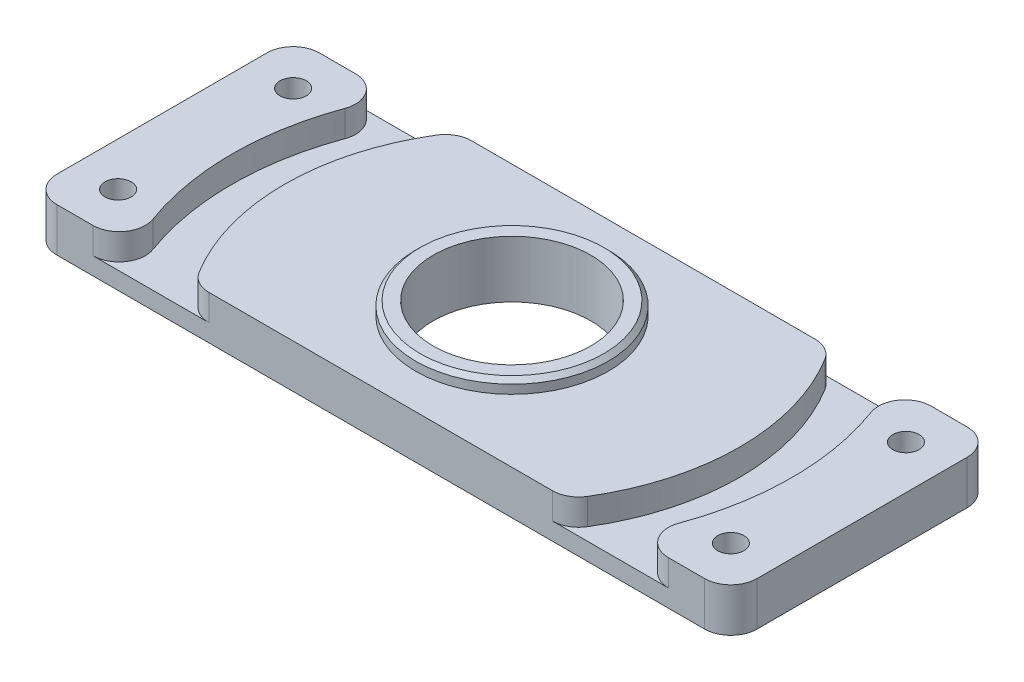
ISO-10303-21;
HEADER;
FILE_DESCRIPTION(('STEP AP214'),'2;1');
FILE_NAME('part.step','',(''),(''),'','','');
FILE_SCHEMA(('AUTOMOTIVE_DESIGN { 1 0 10303 214 1 1 1 1 }'));
ENDSEC;
DATA;
#1=APPLICATION_CONTEXT('core data for automotive mechanical design processes');
#2=APPLICATION_PROTOCOL_DEFINITION('international standard','automotive_design',2000,#1);
#3=PRODUCT_CONTEXT('',#1,'mechanical');
#4=PRODUCT('Part','Part','',(#3));
#5=PRODUCT_RELATED_PRODUCT_CATEGORY('part','',(#4));
#6=PRODUCT_DEFINITION_FORMATION('','',#4);
#7=PRODUCT_DEFINITION_CONTEXT('part definition',#1,'design');
#8=PRODUCT_DEFINITION('design','',#6,#7);
#9=PRODUCT_DEFINITION_SHAPE('','',#8);
#10=(LENGTH_UNIT() NAMED_UNIT(*) SI_UNIT(.MILLI.,.METRE.));
#11=(NAMED_UNIT(*) PLANE_ANGLE_UNIT() SI_UNIT($,.RADIAN.));
#12=(NAMED_UNIT(*) SI_UNIT($,.STERADIAN.) SOLID_ANGLE_UNIT());
#13=UNCERTAINTY_MEASURE_WITH_UNIT(LENGTH_MEASURE(1.E-05),#10,'distance_accuracy_value','');
#14=(GEOMETRIC_REPRESENTATION_CONTEXT(3) GLOBAL_UNCERTAINTY_ASSIGNED_CONTEXT((#13)) GLOBAL_UNIT_ASSIGNED_CONTEXT((#10,
#11,#12)) REPRESENTATION_CONTEXT('',''));
#15=CARTESIAN_POINT('',(0.,0.,0.));
#16=DIRECTION('',(0.,0.,1.));
#17=DIRECTION('',(1.,0.,0.));
#18=AXIS2_PLACEMENT_3D('',#15,#16,#17);
#19=CARTESIAN_POINT('',(0.,0.,0.));
#20=DIRECTION('',(0.,1.,0.));
#21=DIRECTION('',(0.,0.,1.));
#22=AXIS2_PLACEMENT_3D('',#19,#20,#21);
#23=PLANE('',#22);
#24=CARTESIAN_POINT('',(0.,0.,0.));
#25=DIRECTION('',(0.,1.,0.));
#26=DIRECTION('',(0.,0.,1.));
#27=AXIS2_PLACEMENT_3D('',#24,#25,#26);
#28=CIRCLE('',#27,11.);
#29=CARTESIAN_POINT('',(0.,0.,11.));
#30=VERTEX_POINT('',#29);
#31=EDGE_CURVE('E246',#30,#30,#28,.T.);
#32=ORIENTED_EDGE('',*,*,#31,.F.);
#33=EDGE_LOOP('',(#32));
#34=FACE_BOUND('',#33,.T.);
#35=DIRECTION('',(-1.,0.,0.));
#36=VECTOR('',#35,1.);
#37=CARTESIAN_POINT('',(-40.,0.,-15.));
#38=LINE('',#37,#36);
#39=CARTESIAN_POINT('',(19.6214168703486,0.,-15.));
#40=VERTEX_POINT('',#39);
#41=CARTESIAN_POINT('',(-19.6214168703486,0.,-15.));
#42=VERTEX_POINT('',#41);
#43=EDGE_CURVE('E285',#40,#42,#38,.T.);
#44=ORIENTED_EDGE('',*,*,#43,.T.);
#45=CARTESIAN_POINT('',(-19.6214168703486,0.,-12.));
#46=DIRECTION('',(0.,1.,0.));
#47=DIRECTION('',(0.,0.,1.));
#48=AXIS2_PLACEMENT_3D('',#45,#46,#47);
#49=CIRCLE('',#48,3.);
#50=CARTESIAN_POINT('',(-22.1807321143071,0.,-13.5652173913043));
#51=VERTEX_POINT('',#50);
#52=EDGE_CURVE('E345',#42,#51,#49,.T.);
#53=ORIENTED_EDGE('',*,*,#52,.T.);
#54=CARTESIAN_POINT('',(0.,0.,0.));
#55=DIRECTION('',(0.,1.,0.));
#56=DIRECTION('',(0.,0.,1.));
#57=AXIS2_PLACEMENT_3D('',#54,#55,#56);
#58=CIRCLE('',#57,26.);
#59=CARTESIAN_POINT('',(-22.1807321143071,0.,13.5652173913043));
#60=VERTEX_POINT('',#59);
#61=EDGE_CURVE('E244',#51,#60,#58,.T.);
#62=ORIENTED_EDGE('',*,*,#61,.T.);
#63=CARTESIAN_POINT('',(-19.6214168703486,0.,12.));
#64=DIRECTION('',(0.,1.,0.));
#65=DIRECTION('',(0.,0.,1.));
#66=AXIS2_PLACEMENT_3D('',#63,#64,#65);
#67=CIRCLE('',#66,3.);
#68=CARTESIAN_POINT('',(-19.6214168703486,0.,15.));
#69=VERTEX_POINT('',#68);
#70=EDGE_CURVE('E340',#60,#69,#67,.T.);
#71=ORIENTED_EDGE('',*,*,#70,.T.);
#72=DIRECTION('',(1.,0.,0.));
#73=VECTOR('',#72,1.);
#74=CARTESIAN_POINT('',(-40.,0.,15.));
#75=LINE('',#74,#73);
#76=CARTESIAN_POINT('',(19.6214168703486,0.,15.));
#77=VERTEX_POINT('',#76);
#78=EDGE_CURVE('E292',#69,#77,#75,.T.);
#79=ORIENTED_EDGE('',*,*,#78,.T.);
#80=CARTESIAN_POINT('',(19.6214168703486,0.,12.));
#81=DIRECTION('',(0.,1.,0.));
#82=DIRECTION('',(0.,0.,1.));
#83=AXIS2_PLACEMENT_3D('',#80,#81,#82);
#84=CIRCLE('',#83,3.);
#85=CARTESIAN_POINT('',(22.1807321143071,0.,13.5652173913043));
#86=VERTEX_POINT('',#85);
#87=EDGE_CURVE('E339',#77,#86,#84,.T.);
#88=ORIENTED_EDGE('',*,*,#87,.T.);
#89=CARTESIAN_POINT('',(22.1807321143071,0.,-13.5652173913043));
#90=VERTEX_POINT('',#89);
#91=EDGE_CURVE('E253',#86,#90,#58,.T.);
#92=ORIENTED_EDGE('',*,*,#91,.T.);
#93=CARTESIAN_POINT('',(19.6214168703486,0.,-12.));
#94=DIRECTION('',(0.,1.,0.));
#95=DIRECTION('',(0.,0.,1.));
#96=AXIS2_PLACEMENT_3D('',#93,#94,#95);
#97=CIRCLE('',#96,3.);
#98=EDGE_CURVE('E344',#90,#40,#97,.T.);
#99=ORIENTED_EDGE('',*,*,#98,.T.);
#100=EDGE_LOOP('',(#44,#53,#62,#71,#79,#88,#92,#99));
#101=FACE_BOUND('',#100,.T.);
#102=ADVANCED_FACE('F41',(#34,#101),#23,.T.);
#103=CARTESIAN_POINT('',(35.,0.,-10.));
#104=DIRECTION('',(0.,1.,0.));
#105=DIRECTION('',(0.,0.,1.));
#106=AXIS2_PLACEMENT_3D('',#103,#104,#105);
#107=CIRCLE('',#106,1.5);
#108=CARTESIAN_POINT('',(35.,0.,-8.49999999999999));
#109=VERTEX_POINT('',#108);
#110=EDGE_CURVE('E491',#109,#109,#107,.T.);
#111=ORIENTED_EDGE('',*,*,#110,.F.);
#112=EDGE_LOOP('',(#111));
#113=FACE_BOUND('',#112,.T.);
#114=CARTESIAN_POINT('',(35.,0.,10.));
#115=DIRECTION('',(0.,1.,0.));
#116=DIRECTION('',(0.,0.,1.));
#117=AXIS2_PLACEMENT_3D('',#114,#115,#116);
#118=CIRCLE('',#117,1.5);
#119=CARTESIAN_POINT('',(35.,0.,11.5));
#120=VERTEX_POINT('',#119);
#121=EDGE_CURVE('E297',#120,#120,#118,.T.);
#122=ORIENTED_EDGE('',*,*,#121,.F.);
#123=EDGE_LOOP('',(#122));
#124=FACE_BOUND('',#123,.T.);
#125=CARTESIAN_POINT('',(37.,0.,-15.));
#126=VERTEX_POINT('',#125);
#127=CARTESIAN_POINT('',(32.8785644455472,0.,-15.));
#128=VERTEX_POINT('',#127);
#129=EDGE_CURVE('E281',#126,#128,#38,.T.);
#130=ORIENTED_EDGE('',*,*,#129,.T.);
#131=CARTESIAN_POINT('',(32.8785644455472,0.,-12.));
#132=DIRECTION('',(0.,1.,0.));
#133=DIRECTION('',(0.,0.,1.));
#134=AXIS2_PLACEMENT_3D('',#131,#132,#133);
#135=CIRCLE('',#134,3.);
#136=CARTESIAN_POINT('',(30.060401778786,0.,-10.9714285714286));
#137=VERTEX_POINT('',#136);
#138=EDGE_CURVE('E218',#128,#137,#135,.T.);
#139=ORIENTED_EDGE('',*,*,#138,.T.);
#140=CARTESIAN_POINT('',(0.,0.,0.));
#141=DIRECTION('',(0.,1.,0.));
#142=DIRECTION('',(0.,0.,1.));
#143=AXIS2_PLACEMENT_3D('',#140,#141,#142);
#144=CIRCLE('',#143,32.);
#145=CARTESIAN_POINT('',(30.060401778786,0.,10.9714285714286));
#146=VERTEX_POINT('',#145);
#147=EDGE_CURVE('E223',#146,#137,#144,.T.);
#148=ORIENTED_EDGE('',*,*,#147,.F.);
#149=CARTESIAN_POINT('',(32.8785644455472,0.,12.));
#150=DIRECTION('',(0.,1.,0.));
#151=DIRECTION('',(0.,0.,1.));
#152=AXIS2_PLACEMENT_3D('',#149,#150,#151);
#153=CIRCLE('',#152,3.);
#154=CARTESIAN_POINT('',(32.8785644455472,0.,15.));
#155=VERTEX_POINT('',#154);
#156=EDGE_CURVE('E204',#146,#155,#153,.T.);
#157=ORIENTED_EDGE('',*,*,#156,.T.);
#158=CARTESIAN_POINT('',(37.,0.,15.));
#159=VERTEX_POINT('',#158);
#160=EDGE_CURVE('E288',#155,#159,#75,.T.);
#161=ORIENTED_EDGE('',*,*,#160,.T.);
#162=CARTESIAN_POINT('',(37.,0.,12.));
#163=DIRECTION('',(0.,1.,0.));
#164=DIRECTION('',(0.,0.,1.));
#165=AXIS2_PLACEMENT_3D('',#162,#163,#164);
#166=CIRCLE('',#165,3.);
#167=CARTESIAN_POINT('',(40.,0.,12.));
#168=VERTEX_POINT('',#167);
#169=EDGE_CURVE('E316',#159,#168,#166,.T.);
#170=ORIENTED_EDGE('',*,*,#169,.T.);
#171=DIRECTION('',(0.,0.,-1.));
#172=VECTOR('',#171,1.);
#173=CARTESIAN_POINT('',(40.,0.,-15.));
#174=LINE('',#173,#172);
#175=CARTESIAN_POINT('',(40.,0.,-12.));
#176=VERTEX_POINT('',#175);
#177=EDGE_CURVE('E269',#168,#176,#174,.T.);
#178=ORIENTED_EDGE('',*,*,#177,.T.);
#179=CARTESIAN_POINT('',(37.,0.,-12.));
#180=DIRECTION('',(0.,1.,0.));
#181=DIRECTION('',(0.,0.,1.));
#182=AXIS2_PLACEMENT_3D('',#179,#180,#181);
#183=CIRCLE('',#182,3.);
#184=EDGE_CURVE('E219',#176,#126,#183,.T.);
#185=ORIENTED_EDGE('',*,*,#184,.T.);
#186=EDGE_LOOP('',(#130,#139,#148,#157,#161,#170,#178,#185));
#187=FACE_BOUND('',#186,.T.);
#188=ADVANCED_FACE('F235',(#113,#124,#187),#23,.T.);
#189=CARTESIAN_POINT('',(40.,-5.,-15.));
#190=DIRECTION('',(1.,0.,0.));
#191=DIRECTION('',(0.,0.,-1.));
#192=AXIS2_PLACEMENT_3D('',#189,#190,#191);
#193=PLANE('',#192);
#194=DIRECTION('',(0.,0.,-1.));
#195=VECTOR('',#194,1.);
#196=CARTESIAN_POINT('',(40.,-5.,-15.));
#197=LINE('',#196,#195);
#198=CARTESIAN_POINT('',(40.,-5.,12.));
#199=VERTEX_POINT('',#198);
#200=CARTESIAN_POINT('',(40.,-5.,-12.));
#201=VERTEX_POINT('',#200);
#202=EDGE_CURVE('E272',#199,#201,#197,.T.);
#203=ORIENTED_EDGE('',*,*,#202,.T.);
#204=DIRECTION('',(0.,1.,0.));
#205=VECTOR('',#204,1.);
#206=CARTESIAN_POINT('',(40.,-5.,-12.));
#207=LINE('',#206,#205);
#208=EDGE_CURVE('E370',#201,#176,#207,.T.);
#209=ORIENTED_EDGE('',*,*,#208,.T.);
#210=ORIENTED_EDGE('',*,*,#177,.F.);
#211=DIRECTION('',(0.,1.,0.));
#212=VECTOR('',#211,1.);
#213=CARTESIAN_POINT('',(40.,-5.,12.));
#214=LINE('',#213,#212);
#215=EDGE_CURVE('E362',#168,#199,#214,.F.);
#216=ORIENTED_EDGE('',*,*,#215,.T.);
#217=EDGE_LOOP('',(#203,#209,#210,#216));
#218=FACE_BOUND('',#217,.T.);
#219=ADVANCED_FACE('F425',(#218),#193,.T.);
#220=CARTESIAN_POINT('',(-40.,-5.,15.));
#221=DIRECTION('',(0.,0.,1.));
#222=DIRECTION('',(1.,0.,0.));
#223=AXIS2_PLACEMENT_3D('',#220,#221,#222);
#224=PLANE('',#223);
#225=ORIENTED_EDGE('',*,*,#160,.F.);
#226=DIRECTION('',(0.,-1.,0.));
#227=VECTOR('',#226,1.);
#228=CARTESIAN_POINT('',(32.8785644455472,-3.,15.));
#229=LINE('',#228,#227);
#230=CARTESIAN_POINT('',(32.8785644455472,-3.,15.));
#231=VERTEX_POINT('',#230);
#232=EDGE_CURVE('E214',#155,#231,#229,.T.);
#233=ORIENTED_EDGE('',*,*,#232,.T.);
#234=DIRECTION('',(-1.,0.,0.));
#235=VECTOR('',#234,1.);
#236=CARTESIAN_POINT('',(-40.,-3.,15.));
#237=LINE('',#236,#235);
#238=CARTESIAN_POINT('',(19.6214168703486,-3.,15.));
#239=VERTEX_POINT('',#238);
#240=EDGE_CURVE('E489',#231,#239,#237,.T.);
#241=ORIENTED_EDGE('',*,*,#240,.T.);
#242=DIRECTION('',(0.,1.,0.));
#243=VECTOR('',#242,1.);
#244=CARTESIAN_POINT('',(19.6214168703486,-5.,15.));
#245=LINE('',#244,#243);
#246=EDGE_CURVE('E332',#239,#77,#245,.T.);
#247=ORIENTED_EDGE('',*,*,#246,.T.);
#248=ORIENTED_EDGE('',*,*,#78,.F.);
#249=DIRECTION('',(0.,1.,0.));
#250=VECTOR('',#249,1.);
#251=CARTESIAN_POINT('',(-19.6214168703486,-5.,15.));
#252=LINE('',#251,#250);
#253=CARTESIAN_POINT('',(-19.6214168703486,-3.,15.));
#254=VERTEX_POINT('',#253);
#255=EDGE_CURVE('E326',#69,#254,#252,.F.);
#256=ORIENTED_EDGE('',*,*,#255,.T.);
#257=CARTESIAN_POINT('',(-32.8785644455472,-3.,15.));
#258=VERTEX_POINT('',#257);
#259=EDGE_CURVE('E488',#254,#258,#237,.T.);
#260=ORIENTED_EDGE('',*,*,#259,.T.);
#261=DIRECTION('',(0.,-1.,0.));
#262=VECTOR('',#261,1.);
#263=CARTESIAN_POINT('',(-32.8785644455472,0.,15.));
#264=LINE('',#263,#262);
#265=CARTESIAN_POINT('',(-32.8785644455472,0.,15.));
#266=VERTEX_POINT('',#265);
#267=EDGE_CURVE('E327',#258,#266,#264,.F.);
#268=ORIENTED_EDGE('',*,*,#267,.T.);
#269=CARTESIAN_POINT('',(-37.,0.,15.));
#270=VERTEX_POINT('',#269);
#271=EDGE_CURVE('E273',#270,#266,#75,.T.);
#272=ORIENTED_EDGE('',*,*,#271,.F.);
#273=DIRECTION('',(0.,1.,0.));
#274=VECTOR('',#273,1.);
#275=CARTESIAN_POINT('',(-37.,-5.,15.));
#276=LINE('',#275,#274);
#277=CARTESIAN_POINT('',(-37.,-5.,15.));
#278=VERTEX_POINT('',#277);
#279=EDGE_CURVE('E325',#270,#278,#276,.F.);
#280=ORIENTED_EDGE('',*,*,#279,.T.);
#281=DIRECTION('',(1.,0.,0.));
#282=VECTOR('',#281,1.);
#283=CARTESIAN_POINT('',(-40.,-5.,15.));
#284=LINE('',#283,#282);
#285=CARTESIAN_POINT('',(37.,-5.,15.));
#286=VERTEX_POINT('',#285);
#287=EDGE_CURVE('E256',#278,#286,#284,.T.);
#288=ORIENTED_EDGE('',*,*,#287,.T.);
#289=DIRECTION('',(0.,1.,0.));
#290=VECTOR('',#289,1.);
#291=CARTESIAN_POINT('',(37.,-5.,15.));
#292=LINE('',#291,#290);
#293=EDGE_CURVE('E322',#286,#159,#292,.T.);
#294=ORIENTED_EDGE('',*,*,#293,.T.);
#295=EDGE_LOOP('',(#225,#233,#241,#247,#248,#256,#260,#268,#272,#280,#288,#294));
#296=FACE_BOUND('',#295,.T.);
#297=ADVANCED_FACE('F483',(#296),#224,.T.);
#298=CARTESIAN_POINT('',(-40.,-5.,-15.));
#299=DIRECTION('',(-1.,0.,0.));
#300=DIRECTION('',(0.,0.,1.));
#301=AXIS2_PLACEMENT_3D('',#298,#299,#300);
#302=PLANE('',#301);
#303=DIRECTION('',(0.,0.,1.));
#304=VECTOR('',#303,1.);
#305=CARTESIAN_POINT('',(-40.,0.,-15.));
#306=LINE('',#305,#304);
#307=CARTESIAN_POINT('',(-40.,0.,-12.));
#308=VERTEX_POINT('',#307);
#309=CARTESIAN_POINT('',(-40.,0.,12.));
#310=VERTEX_POINT('',#309);
#311=EDGE_CURVE('E286',#308,#310,#306,.T.);
#312=ORIENTED_EDGE('',*,*,#311,.F.);
#313=DIRECTION('',(0.,1.,0.));
#314=VECTOR('',#313,1.);
#315=CARTESIAN_POINT('',(-40.,-5.,-12.));
#316=LINE('',#315,#314);
#317=CARTESIAN_POINT('',(-40.,-5.,-12.));
#318=VERTEX_POINT('',#317);
#319=EDGE_CURVE('E63',#308,#318,#316,.F.);
#320=ORIENTED_EDGE('',*,*,#319,.T.);
#321=DIRECTION('',(0.,0.,1.));
#322=VECTOR('',#321,1.);
#323=CARTESIAN_POINT('',(-40.,-5.,-15.));
#324=LINE('',#323,#322);
#325=CARTESIAN_POINT('',(-40.,-5.,12.));
#326=VERTEX_POINT('',#325);
#327=EDGE_CURVE('E264',#318,#326,#324,.T.);
#328=ORIENTED_EDGE('',*,*,#327,.T.);
#329=DIRECTION('',(0.,1.,0.));
#330=VECTOR('',#329,1.);
#331=CARTESIAN_POINT('',(-40.,-5.,12.));
#332=LINE('',#331,#330);
#333=EDGE_CURVE('E380',#326,#310,#332,.T.);
#334=ORIENTED_EDGE('',*,*,#333,.T.);
#335=EDGE_LOOP('',(#312,#320,#328,#334));
#336=FACE_BOUND('',#335,.T.);
#337=ADVANCED_FACE('F464',(#336),#302,.T.);
#338=CARTESIAN_POINT('',(-40.,-5.,-15.));
#339=DIRECTION('',(0.,0.,-1.));
#340=DIRECTION('',(-1.,0.,0.));
#341=AXIS2_PLACEMENT_3D('',#338,#339,#340);
#342=PLANE('',#341);
#343=DIRECTION('',(1.,0.,0.));
#344=VECTOR('',#343,1.);
#345=CARTESIAN_POINT('',(-40.,-3.,-15.));
#346=LINE('',#345,#344);
#347=CARTESIAN_POINT('',(19.6214168703486,-3.,-15.));
#348=VERTEX_POINT('',#347);
#349=CARTESIAN_POINT('',(32.8785644455472,-3.,-15.));
#350=VERTEX_POINT('',#349);
#351=EDGE_CURVE('E254',#348,#350,#346,.T.);
#352=ORIENTED_EDGE('',*,*,#351,.T.);
#353=DIRECTION('',(0.,-1.,0.));
#354=VECTOR('',#353,1.);
#355=CARTESIAN_POINT('',(32.8785644455472,0.,-15.));
#356=LINE('',#355,#354);
#357=EDGE_CURVE('E320',#350,#128,#356,.F.);
#358=ORIENTED_EDGE('',*,*,#357,.T.);
#359=ORIENTED_EDGE('',*,*,#129,.F.);
#360=DIRECTION('',(0.,1.,0.));
#361=VECTOR('',#360,1.);
#362=CARTESIAN_POINT('',(37.,-5.,-15.));
#363=LINE('',#362,#361);
#364=CARTESIAN_POINT('',(37.,-5.,-15.));
#365=VERTEX_POINT('',#364);
#366=EDGE_CURVE('E306',#126,#365,#363,.F.);
#367=ORIENTED_EDGE('',*,*,#366,.T.);
#368=DIRECTION('',(-1.,0.,0.));
#369=VECTOR('',#368,1.);
#370=CARTESIAN_POINT('',(-40.,-5.,-15.));
#371=LINE('',#370,#369);
#372=CARTESIAN_POINT('',(-37.,-5.,-15.));
#373=VERTEX_POINT('',#372);
#374=EDGE_CURVE('E274',#365,#373,#371,.T.);
#375=ORIENTED_EDGE('',*,*,#374,.T.);
#376=DIRECTION('',(0.,1.,0.));
#377=VECTOR('',#376,1.);
#378=CARTESIAN_POINT('',(-37.,-5.,-15.));
#379=LINE('',#378,#377);
#380=CARTESIAN_POINT('',(-37.,0.,-15.));
#381=VERTEX_POINT('',#380);
#382=EDGE_CURVE('E303',#373,#381,#379,.T.);
#383=ORIENTED_EDGE('',*,*,#382,.T.);
#384=CARTESIAN_POINT('',(-32.8785644455472,0.,-15.));
#385=VERTEX_POINT('',#384);
#386=EDGE_CURVE('E283',#385,#381,#38,.T.);
#387=ORIENTED_EDGE('',*,*,#386,.F.);
#388=DIRECTION('',(0.,-1.,0.));
#389=VECTOR('',#388,1.);
#390=CARTESIAN_POINT('',(-32.8785644455472,-3.,-15.));
#391=LINE('',#390,#389);
#392=CARTESIAN_POINT('',(-32.8785644455472,-3.,-15.));
#393=VERTEX_POINT('',#392);
#394=EDGE_CURVE('E308',#385,#393,#391,.T.);
#395=ORIENTED_EDGE('',*,*,#394,.T.);
#396=CARTESIAN_POINT('',(-19.6214168703486,-3.,-15.));
#397=VERTEX_POINT('',#396);
#398=EDGE_CURVE('E230',#393,#397,#346,.T.);
#399=ORIENTED_EDGE('',*,*,#398,.T.);
#400=DIRECTION('',(0.,1.,0.));
#401=VECTOR('',#400,1.);
#402=CARTESIAN_POINT('',(-19.6214168703486,-5.,-15.));
#403=LINE('',#402,#401);
#404=EDGE_CURVE('E313',#397,#42,#403,.T.);
#405=ORIENTED_EDGE('',*,*,#404,.T.);
#406=ORIENTED_EDGE('',*,*,#43,.F.);
#407=DIRECTION('',(0.,1.,0.));
#408=VECTOR('',#407,1.);
#409=CARTESIAN_POINT('',(19.6214168703486,-5.,-15.));
#410=LINE('',#409,#408);
#411=EDGE_CURVE('E311',#40,#348,#410,.F.);
#412=ORIENTED_EDGE('',*,*,#411,.T.);
#413=EDGE_LOOP('',(#352,#358,#359,#367,#375,#383,#387,#395,#399,#405,#406,#412));
#414=FACE_BOUND('',#413,.T.);
#415=ADVANCED_FACE('F439',(#414),#342,.T.);
#416=CARTESIAN_POINT('',(0.,-5.,0.));
#417=DIRECTION('',(0.,1.,0.));
#418=DIRECTION('',(0.,0.,1.));
#419=AXIS2_PLACEMENT_3D('',#416,#417,#418);
#420=PLANE('',#419);
#421=CARTESIAN_POINT('',(-35.,-5.,10.));
#422=DIRECTION('',(0.,-1.,0.));
#423=DIRECTION('',(0.,0.,1.));
#424=AXIS2_PLACEMENT_3D('',#421,#422,#423);
#425=CIRCLE('',#424,1.5);
#426=CARTESIAN_POINT('',(-35.,-5.,11.5));
#427=VERTEX_POINT('',#426);
#428=EDGE_CURVE('E501',#427,#427,#425,.T.);
#429=ORIENTED_EDGE('',*,*,#428,.F.);
#430=EDGE_LOOP('',(#429));
#431=FACE_BOUND('',#430,.T.);
#432=CARTESIAN_POINT('',(-35.,-5.,-9.99999999999998));
#433=DIRECTION('',(0.,-1.,0.));
#434=DIRECTION('',(0.,0.,1.));
#435=AXIS2_PLACEMENT_3D('',#432,#433,#434);
#436=CIRCLE('',#435,1.5);
#437=CARTESIAN_POINT('',(-35.,-5.,-8.49999999999997));
#438=VERTEX_POINT('',#437);
#439=EDGE_CURVE('E502',#438,#438,#436,.T.);
#440=ORIENTED_EDGE('',*,*,#439,.F.);
#441=EDGE_LOOP('',(#440));
#442=FACE_BOUND('',#441,.T.);
#443=CARTESIAN_POINT('',(35.,-5.,-10.));
#444=DIRECTION('',(0.,-1.,0.));
#445=DIRECTION('',(0.,0.,-1.));
#446=AXIS2_PLACEMENT_3D('',#443,#444,#445);
#447=CIRCLE('',#446,1.5);
#448=CARTESIAN_POINT('',(35.,-5.,-11.5));
#449=VERTEX_POINT('',#448);
#450=EDGE_CURVE('E499',#449,#449,#447,.T.);
#451=ORIENTED_EDGE('',*,*,#450,.F.);
#452=EDGE_LOOP('',(#451));
#453=FACE_BOUND('',#452,.T.);
#454=CARTESIAN_POINT('',(35.,-5.,10.));
#455=DIRECTION('',(0.,-1.,0.));
#456=DIRECTION('',(0.,0.,-1.));
#457=AXIS2_PLACEMENT_3D('',#454,#455,#456);
#458=CIRCLE('',#457,1.5);
#459=CARTESIAN_POINT('',(35.,-5.,8.49999999999999));
#460=VERTEX_POINT('',#459);
#461=EDGE_CURVE('E296',#460,#460,#458,.T.);
#462=ORIENTED_EDGE('',*,*,#461,.F.);
#463=EDGE_LOOP('',(#462));
#464=FACE_BOUND('',#463,.T.);
#465=CARTESIAN_POINT('',(0.,-5.,0.));
#466=DIRECTION('',(0.,1.,0.));
#467=DIRECTION('',(0.,0.,1.));
#468=AXIS2_PLACEMENT_3D('',#465,#466,#467);
#469=CIRCLE('',#468,9.);
#470=CARTESIAN_POINT('',(0.,-5.,9.));
#471=VERTEX_POINT('',#470);
#472=EDGE_CURVE('E270',#471,#471,#469,.T.);
#473=ORIENTED_EDGE('',*,*,#472,.T.);
#474=EDGE_LOOP('',(#473));
#475=FACE_BOUND('',#474,.T.);
#476=ORIENTED_EDGE('',*,*,#374,.F.);
#477=CARTESIAN_POINT('',(37.,-5.,-12.));
#478=DIRECTION('',(0.,1.,0.));
#479=DIRECTION('',(0.,0.,1.));
#480=AXIS2_PLACEMENT_3D('',#477,#478,#479);
#481=CIRCLE('',#480,3.);
#482=EDGE_CURVE('E374',#365,#201,#481,.F.);
#483=ORIENTED_EDGE('',*,*,#482,.T.);
#484=ORIENTED_EDGE('',*,*,#202,.F.);
#485=CARTESIAN_POINT('',(37.,-5.,12.));
#486=DIRECTION('',(0.,1.,0.));
#487=DIRECTION('',(0.,0.,1.));
#488=AXIS2_PLACEMENT_3D('',#485,#486,#487);
#489=CIRCLE('',#488,3.);
#490=EDGE_CURVE('E371',#199,#286,#489,.F.);
#491=ORIENTED_EDGE('',*,*,#490,.T.);
#492=ORIENTED_EDGE('',*,*,#287,.F.);
#493=CARTESIAN_POINT('',(-37.,-5.,12.));
#494=DIRECTION('',(0.,1.,0.));
#495=DIRECTION('',(0.,0.,1.));
#496=AXIS2_PLACEMENT_3D('',#493,#494,#495);
#497=CIRCLE('',#496,3.);
#498=EDGE_CURVE('E60',#278,#326,#497,.F.);
#499=ORIENTED_EDGE('',*,*,#498,.T.);
#500=ORIENTED_EDGE('',*,*,#327,.F.);
#501=CARTESIAN_POINT('',(-37.,-5.,-12.));
#502=DIRECTION('',(0.,1.,0.));
#503=DIRECTION('',(0.,0.,1.));
#504=AXIS2_PLACEMENT_3D('',#501,#502,#503);
#505=CIRCLE('',#504,3.);
#506=EDGE_CURVE('E373',#318,#373,#505,.F.);
#507=ORIENTED_EDGE('',*,*,#506,.T.);
#508=EDGE_LOOP('',(#476,#483,#484,#491,#492,#499,#500,#507));
#509=FACE_BOUND('',#508,.T.);
#510=ADVANCED_FACE('F431',(#431,#442,#453,#464,#475,#509),#420,.F.);
#511=CARTESIAN_POINT('',(-35.,0.,10.));
#512=DIRECTION('',(0.,1.,0.));
#513=DIRECTION('',(0.,0.,1.));
#514=AXIS2_PLACEMENT_3D('',#511,#512,#513);
#515=CIRCLE('',#514,1.5);
#516=CARTESIAN_POINT('',(-35.,0.,11.5));
#517=VERTEX_POINT('',#516);
#518=EDGE_CURVE('E300',#517,#517,#515,.T.);
#519=ORIENTED_EDGE('',*,*,#518,.F.);
#520=EDGE_LOOP('',(#519));
#521=FACE_BOUND('',#520,.T.);
#522=CARTESIAN_POINT('',(-35.,0.,-9.99999999999998));
#523=DIRECTION('',(0.,1.,0.));
#524=DIRECTION('',(0.,0.,1.));
#525=AXIS2_PLACEMENT_3D('',#522,#523,#524);
#526=CIRCLE('',#525,1.5);
#527=CARTESIAN_POINT('',(-35.,0.,-8.49999999999997));
#528=VERTEX_POINT('',#527);
#529=EDGE_CURVE('E295',#528,#528,#526,.T.);
#530=ORIENTED_EDGE('',*,*,#529,.F.);
#531=EDGE_LOOP('',(#530));
#532=FACE_BOUND('',#531,.T.);
#533=CARTESIAN_POINT('',(-30.060401778786,0.,-10.9714285714286));
#534=VERTEX_POINT('',#533);
#535=CARTESIAN_POINT('',(-30.060401778786,0.,10.9714285714286));
#536=VERTEX_POINT('',#535);
#537=EDGE_CURVE('E240',#534,#536,#144,.T.);
#538=ORIENTED_EDGE('',*,*,#537,.F.);
#539=CARTESIAN_POINT('',(-32.8785644455472,0.,-12.));
#540=DIRECTION('',(0.,1.,0.));
#541=DIRECTION('',(0.,0.,1.));
#542=AXIS2_PLACEMENT_3D('',#539,#540,#541);
#543=CIRCLE('',#542,3.);
#544=EDGE_CURVE('E361',#534,#385,#543,.T.);
#545=ORIENTED_EDGE('',*,*,#544,.T.);
#546=ORIENTED_EDGE('',*,*,#386,.T.);
#547=CARTESIAN_POINT('',(-37.,0.,-12.));
#548=DIRECTION('',(0.,1.,0.));
#549=DIRECTION('',(0.,0.,1.));
#550=AXIS2_PLACEMENT_3D('',#547,#548,#549);
#551=CIRCLE('',#550,3.);
#552=EDGE_CURVE('E360',#381,#308,#551,.T.);
#553=ORIENTED_EDGE('',*,*,#552,.T.);
#554=ORIENTED_EDGE('',*,*,#311,.T.);
#555=CARTESIAN_POINT('',(-37.,0.,12.));
#556=DIRECTION('',(0.,1.,0.));
#557=DIRECTION('',(0.,0.,1.));
#558=AXIS2_PLACEMENT_3D('',#555,#556,#557);
#559=CIRCLE('',#558,3.);
#560=EDGE_CURVE('E357',#310,#270,#559,.T.);
#561=ORIENTED_EDGE('',*,*,#560,.T.);
#562=ORIENTED_EDGE('',*,*,#271,.T.);
#563=CARTESIAN_POINT('',(-32.8785644455472,0.,12.));
#564=DIRECTION('',(0.,1.,0.));
#565=DIRECTION('',(0.,0.,1.));
#566=AXIS2_PLACEMENT_3D('',#563,#564,#565);
#567=CIRCLE('',#566,3.);
#568=EDGE_CURVE('E363',#266,#536,#567,.T.);
#569=ORIENTED_EDGE('',*,*,#568,.T.);
#570=EDGE_LOOP('',(#538,#545,#546,#553,#554,#561,#562,#569));
#571=FACE_BOUND('',#570,.T.);
#572=ADVANCED_FACE('F418',(#521,#532,#571),#23,.T.);
#573=CARTESIAN_POINT('',(0.,-5.,0.));
#574=DIRECTION('',(0.,1.,0.));
#575=DIRECTION('',(0.,0.,1.));
#576=AXIS2_PLACEMENT_3D('',#573,#574,#575);
#577=CYLINDRICAL_SURFACE('',#576,9.);
#578=ORIENTED_EDGE('',*,*,#472,.F.);
#579=EDGE_LOOP('',(#578));
#580=FACE_BOUND('',#579,.T.);
#581=CARTESIAN_POINT('',(0.,1.5,0.));
#582=DIRECTION('',(0.,1.,0.));
#583=DIRECTION('',(0.,0.,1.));
#584=AXIS2_PLACEMENT_3D('',#581,#582,#583);
#585=CIRCLE('',#584,9.);
#586=CARTESIAN_POINT('',(0.,1.5,9.));
#587=VERTEX_POINT('',#586);
#588=EDGE_CURVE('E266',#587,#587,#585,.T.);
#589=ORIENTED_EDGE('',*,*,#588,.T.);
#590=EDGE_LOOP('',(#589));
#591=FACE_BOUND('',#590,.T.);
#592=ADVANCED_FACE('F427',(#580,#591),#577,.F.);
#593=CARTESIAN_POINT('',(0.,1.5,0.));
#594=DIRECTION('',(0.,1.,0.));
#595=DIRECTION('',(0.,0.,1.));
#596=AXIS2_PLACEMENT_3D('',#593,#594,#595);
#597=PLANE('',#596);
#598=CARTESIAN_POINT('',(0.,1.5,0.));
#599=DIRECTION('',(0.,1.,0.));
#600=DIRECTION('',(0.,0.,1.));
#601=AXIS2_PLACEMENT_3D('',#598,#599,#600);
#602=CIRCLE('',#601,10.5);
#603=CARTESIAN_POINT('',(0.,1.5,10.5));
#604=VERTEX_POINT('',#603);
#605=EDGE_CURVE('E49',#604,#604,#602,.T.);
#606=ORIENTED_EDGE('',*,*,#605,.T.);
#607=EDGE_LOOP('',(#606));
#608=FACE_BOUND('',#607,.T.);
#609=ORIENTED_EDGE('',*,*,#588,.F.);
#610=EDGE_LOOP('',(#609));
#611=FACE_BOUND('',#610,.T.);
#612=ADVANCED_FACE('F401',(#608,#611),#597,.T.);
#613=CARTESIAN_POINT('',(0.,1.5,0.));
#614=DIRECTION('',(0.,-1.,0.));
#615=DIRECTION('',(0.,0.,-1.));
#616=AXIS2_PLACEMENT_3D('',#613,#614,#615);
#617=CYLINDRICAL_SURFACE('',#616,11.);
#618=CARTESIAN_POINT('',(0.,1.,0.));
#619=DIRECTION('',(0.,1.,0.));
#620=DIRECTION('',(0.,0.,1.));
#621=AXIS2_PLACEMENT_3D('',#618,#619,#620);
#622=CIRCLE('',#621,11.);
#623=CARTESIAN_POINT('',(0.,1.,11.));
#624=VERTEX_POINT('',#623);
#625=EDGE_CURVE('E11',#624,#624,#622,.F.);
#626=ORIENTED_EDGE('',*,*,#625,.T.);
#627=EDGE_LOOP('',(#626));
#628=FACE_BOUND('',#627,.T.);
#629=ORIENTED_EDGE('',*,*,#31,.T.);
#630=EDGE_LOOP('',(#629));
#631=FACE_BOUND('',#630,.T.);
#632=ADVANCED_FACE('F517',(#628,#631),#617,.T.);
#633=CARTESIAN_POINT('',(0.,-3.,0.));
#634=DIRECTION('',(0.,1.,0.));
#635=DIRECTION('',(0.,0.,1.));
#636=AXIS2_PLACEMENT_3D('',#633,#634,#635);
#637=CYLINDRICAL_SURFACE('',#636,26.);
#638=CARTESIAN_POINT('',(0.,-3.,0.));
#639=DIRECTION('',(0.,1.,0.));
#640=DIRECTION('',(0.,0.,1.));
#641=AXIS2_PLACEMENT_3D('',#638,#639,#640);
#642=CIRCLE('',#641,26.);
#643=CARTESIAN_POINT('',(22.1807321143071,-3.,13.5652173913043));
#644=VERTEX_POINT('',#643);
#645=CARTESIAN_POINT('',(22.1807321143071,-3.,-13.5652173913043));
#646=VERTEX_POINT('',#645);
#647=EDGE_CURVE('E232',#644,#646,#642,.T.);
#648=ORIENTED_EDGE('',*,*,#647,.T.);
#649=DIRECTION('',(0.,1.,0.));
#650=VECTOR('',#649,1.);
#651=CARTESIAN_POINT('',(22.1807321143071,-3.,-13.5652173913043));
#652=LINE('',#651,#650);
#653=EDGE_CURVE('E351',#646,#90,#652,.T.);
#654=ORIENTED_EDGE('',*,*,#653,.T.);
#655=ORIENTED_EDGE('',*,*,#91,.F.);
#656=DIRECTION('',(0.,1.,0.));
#657=VECTOR('',#656,1.);
#658=CARTESIAN_POINT('',(22.1807321143071,-3.,13.5652173913043));
#659=LINE('',#658,#657);
#660=EDGE_CURVE('E350',#86,#644,#659,.F.);
#661=ORIENTED_EDGE('',*,*,#660,.T.);
#662=EDGE_LOOP('',(#648,#654,#655,#661));
#663=FACE_BOUND('',#662,.T.);
#664=ADVANCED_FACE('F525',(#663),#637,.T.);
#665=CARTESIAN_POINT('',(0.,-3.,0.));
#666=DIRECTION('',(0.,1.,0.));
#667=DIRECTION('',(0.,0.,1.));
#668=AXIS2_PLACEMENT_3D('',#665,#666,#667);
#669=PLANE('',#668);
#670=ORIENTED_EDGE('',*,*,#240,.F.);
#671=CARTESIAN_POINT('',(32.8785644455472,-3.,12.));
#672=DIRECTION('',(0.,1.,0.));
#673=DIRECTION('',(0.,0.,1.));
#674=AXIS2_PLACEMENT_3D('',#671,#672,#673);
#675=CIRCLE('',#674,3.);
#676=CARTESIAN_POINT('',(30.060401778786,-3.,10.9714285714286));
#677=VERTEX_POINT('',#676);
#678=EDGE_CURVE('E381',#231,#677,#675,.F.);
#679=ORIENTED_EDGE('',*,*,#678,.T.);
#680=CARTESIAN_POINT('',(0.,-3.,0.));
#681=DIRECTION('',(0.,1.,0.));
#682=DIRECTION('',(0.,0.,1.));
#683=AXIS2_PLACEMENT_3D('',#680,#681,#682);
#684=CIRCLE('',#683,32.);
#685=CARTESIAN_POINT('',(30.060401778786,-3.,-10.9714285714286));
#686=VERTEX_POINT('',#685);
#687=EDGE_CURVE('E227',#677,#686,#684,.T.);
#688=ORIENTED_EDGE('',*,*,#687,.T.);
#689=CARTESIAN_POINT('',(32.8785644455472,-3.,-12.));
#690=DIRECTION('',(0.,1.,0.));
#691=DIRECTION('',(0.,0.,1.));
#692=AXIS2_PLACEMENT_3D('',#689,#690,#691);
#693=CIRCLE('',#692,3.);
#694=EDGE_CURVE('E382',#686,#350,#693,.F.);
#695=ORIENTED_EDGE('',*,*,#694,.T.);
#696=ORIENTED_EDGE('',*,*,#351,.F.);
#697=CARTESIAN_POINT('',(19.6214168703486,-3.,-12.));
#698=DIRECTION('',(0.,1.,0.));
#699=DIRECTION('',(0.,0.,1.));
#700=AXIS2_PLACEMENT_3D('',#697,#698,#699);
#701=CIRCLE('',#700,3.);
#702=EDGE_CURVE('E388',#348,#646,#701,.F.);
#703=ORIENTED_EDGE('',*,*,#702,.T.);
#704=ORIENTED_EDGE('',*,*,#647,.F.);
#705=CARTESIAN_POINT('',(19.6214168703486,-3.,12.));
#706=DIRECTION('',(0.,1.,0.));
#707=DIRECTION('',(0.,0.,1.));
#708=AXIS2_PLACEMENT_3D('',#705,#706,#707);
#709=CIRCLE('',#708,3.);
#710=EDGE_CURVE('E393',#644,#239,#709,.F.);
#711=ORIENTED_EDGE('',*,*,#710,.T.);
#712=EDGE_LOOP('',(#670,#679,#688,#695,#696,#703,#704,#711));
#713=FACE_BOUND('',#712,.T.);
#714=ADVANCED_FACE('F531',(#713),#669,.T.);
#715=CARTESIAN_POINT('',(0.,-3.,0.));
#716=DIRECTION('',(0.,1.,0.));
#717=DIRECTION('',(0.,0.,1.));
#718=AXIS2_PLACEMENT_3D('',#715,#716,#717);
#719=CYLINDRICAL_SURFACE('',#718,32.);
#720=ORIENTED_EDGE('',*,*,#147,.T.);
#721=DIRECTION('',(0.,1.,0.));
#722=VECTOR('',#721,1.);
#723=CARTESIAN_POINT('',(30.060401778786,-3.,-10.9714285714286));
#724=LINE('',#723,#722);
#725=EDGE_CURVE('E226',#137,#686,#724,.F.);
#726=ORIENTED_EDGE('',*,*,#725,.T.);
#727=ORIENTED_EDGE('',*,*,#687,.F.);
#728=DIRECTION('',(0.,1.,0.));
#729=VECTOR('',#728,1.);
#730=CARTESIAN_POINT('',(30.060401778786,-3.,10.9714285714286));
#731=LINE('',#730,#729);
#732=EDGE_CURVE('E209',#677,#146,#731,.T.);
#733=ORIENTED_EDGE('',*,*,#732,.T.);
#734=EDGE_LOOP('',(#720,#726,#727,#733));
#735=FACE_BOUND('',#734,.T.);
#736=ADVANCED_FACE('F225',(#735),#719,.F.);
#737=CARTESIAN_POINT('',(-30.060401778786,-3.,-10.9714285714286));
#738=VERTEX_POINT('',#737);
#739=CARTESIAN_POINT('',(-30.060401778786,-3.,10.9714285714286));
#740=VERTEX_POINT('',#739);
#741=EDGE_CURVE('E234',#738,#740,#684,.T.);
#742=ORIENTED_EDGE('',*,*,#741,.F.);
#743=DIRECTION('',(0.,1.,0.));
#744=VECTOR('',#743,1.);
#745=CARTESIAN_POINT('',(-30.060401778786,-3.,-10.9714285714286));
#746=LINE('',#745,#744);
#747=EDGE_CURVE('E354',#738,#534,#746,.T.);
#748=ORIENTED_EDGE('',*,*,#747,.T.);
#749=ORIENTED_EDGE('',*,*,#537,.T.);
#750=DIRECTION('',(0.,1.,0.));
#751=VECTOR('',#750,1.);
#752=CARTESIAN_POINT('',(-30.060401778786,-3.,10.9714285714286));
#753=LINE('',#752,#751);
#754=EDGE_CURVE('E352',#536,#740,#753,.F.);
#755=ORIENTED_EDGE('',*,*,#754,.T.);
#756=EDGE_LOOP('',(#742,#748,#749,#755));
#757=FACE_BOUND('',#756,.T.);
#758=ADVANCED_FACE('F455',(#757),#719,.F.);
#759=CARTESIAN_POINT('',(-22.1807321143071,-3.,-13.5652173913043));
#760=VERTEX_POINT('',#759);
#761=CARTESIAN_POINT('',(-22.1807321143071,-3.,13.5652173913043));
#762=VERTEX_POINT('',#761);
#763=EDGE_CURVE('E241',#760,#762,#642,.T.);
#764=ORIENTED_EDGE('',*,*,#763,.F.);
#765=CARTESIAN_POINT('',(-19.6214168703486,-3.,-12.));
#766=DIRECTION('',(0.,1.,0.));
#767=DIRECTION('',(0.,0.,1.));
#768=AXIS2_PLACEMENT_3D('',#765,#766,#767);
#769=CIRCLE('',#768,3.);
#770=EDGE_CURVE('E389',#760,#397,#769,.F.);
#771=ORIENTED_EDGE('',*,*,#770,.T.);
#772=ORIENTED_EDGE('',*,*,#398,.F.);
#773=CARTESIAN_POINT('',(-32.8785644455472,-3.,-12.));
#774=DIRECTION('',(0.,1.,0.));
#775=DIRECTION('',(0.,0.,1.));
#776=AXIS2_PLACEMENT_3D('',#773,#774,#775);
#777=CIRCLE('',#776,3.);
#778=EDGE_CURVE('E396',#393,#738,#777,.F.);
#779=ORIENTED_EDGE('',*,*,#778,.T.);
#780=ORIENTED_EDGE('',*,*,#741,.T.);
#781=CARTESIAN_POINT('',(-32.8785644455472,-3.,12.));
#782=DIRECTION('',(0.,1.,0.));
#783=DIRECTION('',(0.,0.,1.));
#784=AXIS2_PLACEMENT_3D('',#781,#782,#783);
#785=CIRCLE('',#784,3.);
#786=EDGE_CURVE('E397',#740,#258,#785,.F.);
#787=ORIENTED_EDGE('',*,*,#786,.T.);
#788=ORIENTED_EDGE('',*,*,#259,.F.);
#789=CARTESIAN_POINT('',(-19.6214168703486,-3.,12.));
#790=DIRECTION('',(0.,1.,0.));
#791=DIRECTION('',(0.,0.,1.));
#792=AXIS2_PLACEMENT_3D('',#789,#790,#791);
#793=CIRCLE('',#792,3.);
#794=EDGE_CURVE('E395',#254,#762,#793,.F.);
#795=ORIENTED_EDGE('',*,*,#794,.T.);
#796=EDGE_LOOP('',(#764,#771,#772,#779,#780,#787,#788,#795));
#797=FACE_BOUND('',#796,.T.);
#798=ADVANCED_FACE('F459',(#797),#669,.T.);
#799=ORIENTED_EDGE('',*,*,#61,.F.);
#800=DIRECTION('',(0.,1.,0.));
#801=VECTOR('',#800,1.);
#802=CARTESIAN_POINT('',(-22.1807321143071,-3.,-13.5652173913043));
#803=LINE('',#802,#801);
#804=EDGE_CURVE('E349',#51,#760,#803,.F.);
#805=ORIENTED_EDGE('',*,*,#804,.T.);
#806=ORIENTED_EDGE('',*,*,#763,.T.);
#807=DIRECTION('',(0.,1.,0.));
#808=VECTOR('',#807,1.);
#809=CARTESIAN_POINT('',(-22.1807321143071,-3.,13.5652173913043));
#810=LINE('',#809,#808);
#811=EDGE_CURVE('E342',#762,#60,#810,.T.);
#812=ORIENTED_EDGE('',*,*,#811,.T.);
#813=EDGE_LOOP('',(#799,#805,#806,#812));
#814=FACE_BOUND('',#813,.T.);
#815=ADVANCED_FACE('F535',(#814),#637,.T.);
#816=CARTESIAN_POINT('',(-35.,5.,-9.99999999999998));
#817=DIRECTION('',(0.,-1.,0.));
#818=DIRECTION('',(0.,0.,-1.));
#819=AXIS2_PLACEMENT_3D('',#816,#817,#818);
#820=CYLINDRICAL_SURFACE('',#819,1.5);
#821=ORIENTED_EDGE('',*,*,#529,.T.);
#822=EDGE_LOOP('',(#821));
#823=FACE_BOUND('',#822,.T.);
#824=ORIENTED_EDGE('',*,*,#439,.T.);
#825=EDGE_LOOP('',(#824));
#826=FACE_BOUND('',#825,.T.);
#827=ADVANCED_FACE('F539',(#823,#826),#820,.F.);
#828=CARTESIAN_POINT('',(-35.,5.,10.));
#829=DIRECTION('',(0.,-1.,0.));
#830=DIRECTION('',(0.,0.,-1.));
#831=AXIS2_PLACEMENT_3D('',#828,#829,#830);
#832=CYLINDRICAL_SURFACE('',#831,1.5);
#833=ORIENTED_EDGE('',*,*,#518,.T.);
#834=EDGE_LOOP('',(#833));
#835=FACE_BOUND('',#834,.T.);
#836=ORIENTED_EDGE('',*,*,#428,.T.);
#837=EDGE_LOOP('',(#836));
#838=FACE_BOUND('',#837,.T.);
#839=ADVANCED_FACE('F543',(#835,#838),#832,.F.);
#840=CARTESIAN_POINT('',(35.,5.,10.));
#841=DIRECTION('',(0.,-1.,0.));
#842=DIRECTION('',(0.,0.,-1.));
#843=AXIS2_PLACEMENT_3D('',#840,#841,#842);
#844=CYLINDRICAL_SURFACE('',#843,1.5);
#845=ORIENTED_EDGE('',*,*,#121,.T.);
#846=EDGE_LOOP('',(#845));
#847=FACE_BOUND('',#846,.T.);
#848=ORIENTED_EDGE('',*,*,#461,.T.);
#849=EDGE_LOOP('',(#848));
#850=FACE_BOUND('',#849,.T.);
#851=ADVANCED_FACE('F540',(#847,#850),#844,.F.);
#852=CARTESIAN_POINT('',(35.,5.,-10.));
#853=DIRECTION('',(0.,-1.,0.));
#854=DIRECTION('',(0.,0.,-1.));
#855=AXIS2_PLACEMENT_3D('',#852,#853,#854);
#856=CYLINDRICAL_SURFACE('',#855,1.5);
#857=ORIENTED_EDGE('',*,*,#110,.T.);
#858=EDGE_LOOP('',(#857));
#859=FACE_BOUND('',#858,.T.);
#860=ORIENTED_EDGE('',*,*,#450,.T.);
#861=EDGE_LOOP('',(#860));
#862=FACE_BOUND('',#861,.T.);
#863=ADVANCED_FACE('F509',(#859,#862),#856,.F.);
#864=CARTESIAN_POINT('',(32.8785644455472,-3.,-12.));
#865=DIRECTION('',(0.,1.,0.));
#866=DIRECTION('',(0.,0.,1.));
#867=AXIS2_PLACEMENT_3D('',#864,#865,#866);
#868=CYLINDRICAL_SURFACE('',#867,3.);
#869=ORIENTED_EDGE('',*,*,#138,.F.);
#870=ORIENTED_EDGE('',*,*,#357,.F.);
#871=ORIENTED_EDGE('',*,*,#694,.F.);
#872=ORIENTED_EDGE('',*,*,#725,.F.);
#873=EDGE_LOOP('',(#869,#870,#871,#872));
#874=FACE_BOUND('',#873,.T.);
#875=ADVANCED_FACE('F548',(#874),#868,.T.);
#876=CARTESIAN_POINT('',(32.8785644455472,-3.,12.));
#877=DIRECTION('',(0.,1.,0.));
#878=DIRECTION('',(0.,0.,1.));
#879=AXIS2_PLACEMENT_3D('',#876,#877,#878);
#880=CYLINDRICAL_SURFACE('',#879,3.);
#881=ORIENTED_EDGE('',*,*,#678,.F.);
#882=ORIENTED_EDGE('',*,*,#232,.F.);
#883=ORIENTED_EDGE('',*,*,#156,.F.);
#884=ORIENTED_EDGE('',*,*,#732,.F.);
#885=EDGE_LOOP('',(#881,#882,#883,#884));
#886=FACE_BOUND('',#885,.T.);
#887=ADVANCED_FACE('F206',(#886),#880,.T.);
#888=CARTESIAN_POINT('',(-19.6214168703486,-3.,-12.));
#889=DIRECTION('',(0.,1.,0.));
#890=DIRECTION('',(0.,0.,1.));
#891=AXIS2_PLACEMENT_3D('',#888,#889,#890);
#892=CYLINDRICAL_SURFACE('',#891,3.);
#893=ORIENTED_EDGE('',*,*,#770,.F.);
#894=ORIENTED_EDGE('',*,*,#804,.F.);
#895=ORIENTED_EDGE('',*,*,#52,.F.);
#896=ORIENTED_EDGE('',*,*,#404,.F.);
#897=EDGE_LOOP('',(#893,#894,#895,#896));
#898=FACE_BOUND('',#897,.T.);
#899=ADVANCED_FACE('F563',(#898),#892,.T.);
#900=CARTESIAN_POINT('',(19.6214168703486,-3.,-12.));
#901=DIRECTION('',(0.,1.,0.));
#902=DIRECTION('',(0.,0.,1.));
#903=AXIS2_PLACEMENT_3D('',#900,#901,#902);
#904=CYLINDRICAL_SURFACE('',#903,3.);
#905=ORIENTED_EDGE('',*,*,#98,.F.);
#906=ORIENTED_EDGE('',*,*,#653,.F.);
#907=ORIENTED_EDGE('',*,*,#702,.F.);
#908=ORIENTED_EDGE('',*,*,#411,.F.);
#909=EDGE_LOOP('',(#905,#906,#907,#908));
#910=FACE_BOUND('',#909,.T.);
#911=ADVANCED_FACE('F569',(#910),#904,.T.);
#912=CARTESIAN_POINT('',(19.6214168703486,-3.,12.));
#913=DIRECTION('',(0.,1.,0.));
#914=DIRECTION('',(0.,0.,1.));
#915=AXIS2_PLACEMENT_3D('',#912,#913,#914);
#916=CYLINDRICAL_SURFACE('',#915,3.);
#917=ORIENTED_EDGE('',*,*,#710,.F.);
#918=ORIENTED_EDGE('',*,*,#660,.F.);
#919=ORIENTED_EDGE('',*,*,#87,.F.);
#920=ORIENTED_EDGE('',*,*,#246,.F.);
#921=EDGE_LOOP('',(#917,#918,#919,#920));
#922=FACE_BOUND('',#921,.T.);
#923=ADVANCED_FACE('F573',(#922),#916,.T.);
#924=CARTESIAN_POINT('',(-19.6214168703486,-3.,12.));
#925=DIRECTION('',(0.,1.,0.));
#926=DIRECTION('',(0.,0.,1.));
#927=AXIS2_PLACEMENT_3D('',#924,#925,#926);
#928=CYLINDRICAL_SURFACE('',#927,3.);
#929=ORIENTED_EDGE('',*,*,#70,.F.);
#930=ORIENTED_EDGE('',*,*,#811,.F.);
#931=ORIENTED_EDGE('',*,*,#794,.F.);
#932=ORIENTED_EDGE('',*,*,#255,.F.);
#933=EDGE_LOOP('',(#929,#930,#931,#932));
#934=FACE_BOUND('',#933,.T.);
#935=ADVANCED_FACE('F579',(#934),#928,.T.);
#936=CARTESIAN_POINT('',(-32.8785644455472,-3.,-12.));
#937=DIRECTION('',(0.,1.,0.));
#938=DIRECTION('',(0.,0.,1.));
#939=AXIS2_PLACEMENT_3D('',#936,#937,#938);
#940=CYLINDRICAL_SURFACE('',#939,3.);
#941=ORIENTED_EDGE('',*,*,#778,.F.);
#942=ORIENTED_EDGE('',*,*,#394,.F.);
#943=ORIENTED_EDGE('',*,*,#544,.F.);
#944=ORIENTED_EDGE('',*,*,#747,.F.);
#945=EDGE_LOOP('',(#941,#942,#943,#944));
#946=FACE_BOUND('',#945,.T.);
#947=ADVANCED_FACE('F461',(#946),#940,.T.);
#948=CARTESIAN_POINT('',(-32.8785644455472,-3.,12.));
#949=DIRECTION('',(0.,1.,0.));
#950=DIRECTION('',(0.,0.,1.));
#951=AXIS2_PLACEMENT_3D('',#948,#949,#950);
#952=CYLINDRICAL_SURFACE('',#951,3.);
#953=ORIENTED_EDGE('',*,*,#568,.F.);
#954=ORIENTED_EDGE('',*,*,#267,.F.);
#955=ORIENTED_EDGE('',*,*,#786,.F.);
#956=ORIENTED_EDGE('',*,*,#754,.F.);
#957=EDGE_LOOP('',(#953,#954,#955,#956));
#958=FACE_BOUND('',#957,.T.);
#959=ADVANCED_FACE('F454',(#958),#952,.T.);
#960=CARTESIAN_POINT('',(37.,-5.,-12.));
#961=DIRECTION('',(0.,1.,0.));
#962=DIRECTION('',(0.,0.,1.));
#963=AXIS2_PLACEMENT_3D('',#960,#961,#962);
#964=CYLINDRICAL_SURFACE('',#963,3.);
#965=ORIENTED_EDGE('',*,*,#482,.F.);
#966=ORIENTED_EDGE('',*,*,#366,.F.);
#967=ORIENTED_EDGE('',*,*,#184,.F.);
#968=ORIENTED_EDGE('',*,*,#208,.F.);
#969=EDGE_LOOP('',(#965,#966,#967,#968));
#970=FACE_BOUND('',#969,.T.);
#971=ADVANCED_FACE('F473',(#970),#964,.T.);
#972=CARTESIAN_POINT('',(-37.,-5.,-12.));
#973=DIRECTION('',(0.,1.,0.));
#974=DIRECTION('',(0.,0.,1.));
#975=AXIS2_PLACEMENT_3D('',#972,#973,#974);
#976=CYLINDRICAL_SURFACE('',#975,3.);
#977=ORIENTED_EDGE('',*,*,#506,.F.);
#978=ORIENTED_EDGE('',*,*,#319,.F.);
#979=ORIENTED_EDGE('',*,*,#552,.F.);
#980=ORIENTED_EDGE('',*,*,#382,.F.);
#981=EDGE_LOOP('',(#977,#978,#979,#980));
#982=FACE_BOUND('',#981,.T.);
#983=ADVANCED_FACE('F466',(#982),#976,.T.);
#984=CARTESIAN_POINT('',(37.,-5.,12.));
#985=DIRECTION('',(0.,1.,0.));
#986=DIRECTION('',(0.,0.,1.));
#987=AXIS2_PLACEMENT_3D('',#984,#985,#986);
#988=CYLINDRICAL_SURFACE('',#987,3.);
#989=ORIENTED_EDGE('',*,*,#490,.F.);
#990=ORIENTED_EDGE('',*,*,#215,.F.);
#991=ORIENTED_EDGE('',*,*,#169,.F.);
#992=ORIENTED_EDGE('',*,*,#293,.F.);
#993=EDGE_LOOP('',(#989,#990,#991,#992));
#994=FACE_BOUND('',#993,.T.);
#995=ADVANCED_FACE('F412',(#994),#988,.T.);
#996=CARTESIAN_POINT('',(-37.,-5.,12.));
#997=DIRECTION('',(0.,1.,0.));
#998=DIRECTION('',(0.,0.,1.));
#999=AXIS2_PLACEMENT_3D('',#996,#997,#998);
#1000=CYLINDRICAL_SURFACE('',#999,3.);
#1001=ORIENTED_EDGE('',*,*,#498,.F.);
#1002=ORIENTED_EDGE('',*,*,#279,.F.);
#1003=ORIENTED_EDGE('',*,*,#560,.F.);
#1004=ORIENTED_EDGE('',*,*,#333,.F.);
#1005=EDGE_LOOP('',(#1001,#1002,#1003,#1004));
#1006=FACE_BOUND('',#1005,.T.);
#1007=ADVANCED_FACE('F406',(#1006),#1000,.T.);
#1008=CARTESIAN_POINT('',(0.,1.5,0.));
#1009=DIRECTION('',(0.,-1.,0.));
#1010=DIRECTION('',(0.,0.,-1.));
#1011=AXIS2_PLACEMENT_3D('',#1008,#1009,#1010);
#1012=CONICAL_SURFACE('',#1011,10.5,0.785398163397452);
#1013=ORIENTED_EDGE('',*,*,#625,.F.);
#1014=EDGE_LOOP('',(#1013));
#1015=FACE_BOUND('',#1014,.T.);
#1016=ORIENTED_EDGE('',*,*,#605,.F.);
#1017=EDGE_LOOP('',(#1016));
#1018=FACE_BOUND('',#1017,.T.);
#1019=ADVANCED_FACE('F42',(#1015,#1018),#1012,.T.);
#1020=CLOSED_SHELL('',(#102,#188,#219,#297,#337,#415,#510,#572,#592,#612,#632,#664,#714,#736,
#758,#798,#815,#827,#839,#851,#863,#875,#887,#899,#911,#923,#935,#947,#959,#971,#983,#995,#1007,#1019));
#1021=MANIFOLD_SOLID_BREP('B2',#1020);
#1022=ADVANCED_BREP_SHAPE_REPRESENTATION('',(#18,#1021),#14);
#1023=SHAPE_DEFINITION_REPRESENTATION(#9,#1022);
ENDSEC;
END-ISO-10303-21;
